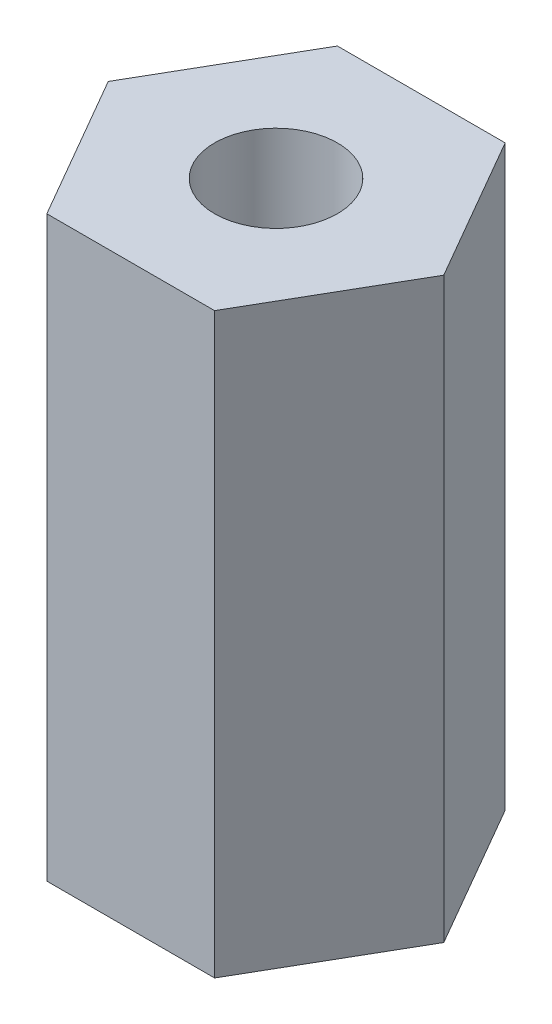
ISO-10303-21;
HEADER;
FILE_DESCRIPTION(('STEP AP214'),'2;1');
FILE_NAME('part.step','',(''),(''),'','','');
FILE_SCHEMA(('AUTOMOTIVE_DESIGN { 1 0 10303 214 1 1 1 1 }'));
ENDSEC;
DATA;
#1=APPLICATION_CONTEXT('core data for automotive mechanical design processes');
#2=APPLICATION_PROTOCOL_DEFINITION('international standard','automotive_design',2000,#1);
#3=PRODUCT_CONTEXT('',#1,'mechanical');
#4=PRODUCT('Part','Part','',(#3));
#5=PRODUCT_RELATED_PRODUCT_CATEGORY('part','',(#4));
#6=PRODUCT_DEFINITION_FORMATION('','',#4);
#7=PRODUCT_DEFINITION_CONTEXT('part definition',#1,'design');
#8=PRODUCT_DEFINITION('design','',#6,#7);
#9=PRODUCT_DEFINITION_SHAPE('','',#8);
#10=(LENGTH_UNIT() NAMED_UNIT(*) SI_UNIT(.MILLI.,.METRE.));
#11=(NAMED_UNIT(*) PLANE_ANGLE_UNIT() SI_UNIT($,.RADIAN.));
#12=(NAMED_UNIT(*) SI_UNIT($,.STERADIAN.) SOLID_ANGLE_UNIT());
#13=UNCERTAINTY_MEASURE_WITH_UNIT(LENGTH_MEASURE(1.E-05),#10,'distance_accuracy_value','');
#14=(GEOMETRIC_REPRESENTATION_CONTEXT(3) GLOBAL_UNCERTAINTY_ASSIGNED_CONTEXT((#13)) GLOBAL_UNIT_ASSIGNED_CONTEXT((#10,
#11,#12)) REPRESENTATION_CONTEXT('',''));
#15=CARTESIAN_POINT('',(0.,0.,0.));
#16=DIRECTION('',(0.,0.,1.));
#17=DIRECTION('',(1.,0.,0.));
#18=AXIS2_PLACEMENT_3D('',#15,#16,#17);
#19=CARTESIAN_POINT('',(1.84752086140683,12.73,-3.20000000000004));
#20=DIRECTION('',(0.,0.,1.));
#21=DIRECTION('',(1.,0.,0.));
#22=AXIS2_PLACEMENT_3D('',#19,#20,#21);
#23=PLANE('',#22);
#24=DIRECTION('',(-1.,0.,0.));
#25=VECTOR('',#24,1.);
#26=CARTESIAN_POINT('',(1.84752086140683,0.,-3.20000000000004));
#27=LINE('',#26,#25);
#28=CARTESIAN_POINT('',(1.84752086140683,0.,-3.20000000000004));
#29=VERTEX_POINT('',#28);
#30=CARTESIAN_POINT('',(-1.84752086140682,0.,-3.20000000000004));
#31=VERTEX_POINT('',#30);
#32=EDGE_CURVE('E130',#29,#31,#27,.T.);
#33=ORIENTED_EDGE('',*,*,#32,.T.);
#34=DIRECTION('',(0.,-1.,0.));
#35=VECTOR('',#34,1.);
#36=CARTESIAN_POINT('',(-1.84752086140682,12.73,-3.20000000000004));
#37=LINE('',#36,#35);
#38=CARTESIAN_POINT('',(-1.84752086140682,12.73,-3.20000000000004));
#39=VERTEX_POINT('',#38);
#40=EDGE_CURVE('E11',#39,#31,#37,.T.);
#41=ORIENTED_EDGE('',*,*,#40,.F.);
#42=DIRECTION('',(-1.,0.,0.));
#43=VECTOR('',#42,1.);
#44=CARTESIAN_POINT('',(1.84752086140683,12.73,-3.20000000000004));
#45=LINE('',#44,#43);
#46=CARTESIAN_POINT('',(1.84752086140683,12.73,-3.20000000000004));
#47=VERTEX_POINT('',#46);
#48=EDGE_CURVE('E147',#47,#39,#45,.T.);
#49=ORIENTED_EDGE('',*,*,#48,.F.);
#50=DIRECTION('',(0.,-1.,0.));
#51=VECTOR('',#50,1.);
#52=CARTESIAN_POINT('',(1.84752086140683,12.73,-3.20000000000004));
#53=LINE('',#52,#51);
#54=EDGE_CURVE('E126',#47,#29,#53,.T.);
#55=ORIENTED_EDGE('',*,*,#54,.T.);
#56=EDGE_LOOP('',(#33,#41,#49,#55));
#57=FACE_BOUND('',#56,.T.);
#58=ADVANCED_FACE('F41',(#57),#23,.F.);
#59=CARTESIAN_POINT('',(-1.84752086140682,12.73,-3.20000000000004));
#60=DIRECTION('',(0.866025403784438,0.,0.500000000000001));
#61=DIRECTION('',(0.500000000000001,0.,-0.866025403784438));
#62=AXIS2_PLACEMENT_3D('',#59,#60,#61);
#63=PLANE('',#62);
#64=DIRECTION('',(-0.500000000000001,0.,0.866025403784438));
#65=VECTOR('',#64,1.);
#66=CARTESIAN_POINT('',(-1.84752086140682,0.,-3.20000000000004));
#67=LINE('',#66,#65);
#68=CARTESIAN_POINT('',(-3.69504172281365,0.,0.));
#69=VERTEX_POINT('',#68);
#70=EDGE_CURVE('E134',#31,#69,#67,.T.);
#71=ORIENTED_EDGE('',*,*,#70,.T.);
#72=DIRECTION('',(0.,-1.,0.));
#73=VECTOR('',#72,1.);
#74=CARTESIAN_POINT('',(-3.69504172281365,12.73,0.));
#75=LINE('',#74,#73);
#76=CARTESIAN_POINT('',(-3.69504172281365,12.73,0.));
#77=VERTEX_POINT('',#76);
#78=EDGE_CURVE('E50',#77,#69,#75,.T.);
#79=ORIENTED_EDGE('',*,*,#78,.F.);
#80=DIRECTION('',(-0.500000000000001,0.,0.866025403784438));
#81=VECTOR('',#80,1.);
#82=CARTESIAN_POINT('',(-1.84752086140682,12.73,-3.20000000000004));
#83=LINE('',#82,#81);
#84=EDGE_CURVE('E95',#39,#77,#83,.T.);
#85=ORIENTED_EDGE('',*,*,#84,.F.);
#86=ORIENTED_EDGE('',*,*,#40,.T.);
#87=EDGE_LOOP('',(#71,#79,#85,#86));
#88=FACE_BOUND('',#87,.T.);
#89=ADVANCED_FACE('F176',(#88),#63,.F.);
#90=CARTESIAN_POINT('',(-3.69504172281365,12.73,0.));
#91=DIRECTION('',(0.866025403784439,0.,-0.5));
#92=DIRECTION('',(-0.5,0.,-0.866025403784439));
#93=AXIS2_PLACEMENT_3D('',#90,#91,#92);
#94=PLANE('',#93);
#95=DIRECTION('',(0.5,0.,0.866025403784439));
#96=VECTOR('',#95,1.);
#97=CARTESIAN_POINT('',(-3.69504172281365,0.,0.));
#98=LINE('',#97,#96);
#99=CARTESIAN_POINT('',(-1.84752086140681,0.,3.20000000000006));
#100=VERTEX_POINT('',#99);
#101=EDGE_CURVE('E138',#69,#100,#98,.T.);
#102=ORIENTED_EDGE('',*,*,#101,.T.);
#103=DIRECTION('',(0.,-1.,0.));
#104=VECTOR('',#103,1.);
#105=CARTESIAN_POINT('',(-1.84752086140681,12.73,3.20000000000006));
#106=LINE('',#105,#104);
#107=CARTESIAN_POINT('',(-1.84752086140681,12.73,3.20000000000006));
#108=VERTEX_POINT('',#107);
#109=EDGE_CURVE('E119',#108,#100,#106,.T.);
#110=ORIENTED_EDGE('',*,*,#109,.F.);
#111=DIRECTION('',(0.5,0.,0.866025403784439));
#112=VECTOR('',#111,1.);
#113=CARTESIAN_POINT('',(-3.69504172281365,12.73,0.));
#114=LINE('',#113,#112);
#115=EDGE_CURVE('E108',#77,#108,#114,.T.);
#116=ORIENTED_EDGE('',*,*,#115,.F.);
#117=ORIENTED_EDGE('',*,*,#78,.T.);
#118=EDGE_LOOP('',(#102,#110,#116,#117));
#119=FACE_BOUND('',#118,.T.);
#120=ADVANCED_FACE('F157',(#119),#94,.F.);
#121=CARTESIAN_POINT('',(-1.84752086140681,12.73,3.20000000000006));
#122=DIRECTION('',(0.,0.,-1.));
#123=DIRECTION('',(-1.,0.,0.));
#124=AXIS2_PLACEMENT_3D('',#121,#122,#123);
#125=PLANE('',#124);
#126=DIRECTION('',(1.,0.,0.));
#127=VECTOR('',#126,1.);
#128=CARTESIAN_POINT('',(-1.84752086140681,0.,3.20000000000006));
#129=LINE('',#128,#127);
#130=CARTESIAN_POINT('',(1.84752086140684,0.,3.20000000000006));
#131=VERTEX_POINT('',#130);
#132=EDGE_CURVE('E117',#100,#131,#129,.T.);
#133=ORIENTED_EDGE('',*,*,#132,.T.);
#134=DIRECTION('',(0.,-1.,0.));
#135=VECTOR('',#134,1.);
#136=CARTESIAN_POINT('',(1.84752086140684,12.73,3.20000000000006));
#137=LINE('',#136,#135);
#138=CARTESIAN_POINT('',(1.84752086140684,12.73,3.20000000000006));
#139=VERTEX_POINT('',#138);
#140=EDGE_CURVE('E114',#139,#131,#137,.T.);
#141=ORIENTED_EDGE('',*,*,#140,.F.);
#142=DIRECTION('',(1.,0.,0.));
#143=VECTOR('',#142,1.);
#144=CARTESIAN_POINT('',(-1.84752086140681,12.73,3.20000000000006));
#145=LINE('',#144,#143);
#146=EDGE_CURVE('E102',#108,#139,#145,.T.);
#147=ORIENTED_EDGE('',*,*,#146,.F.);
#148=ORIENTED_EDGE('',*,*,#109,.T.);
#149=EDGE_LOOP('',(#133,#141,#147,#148));
#150=FACE_BOUND('',#149,.T.);
#151=ADVANCED_FACE('F115',(#150),#125,.F.);
#152=CARTESIAN_POINT('',(1.84752086140684,12.73,3.20000000000006));
#153=DIRECTION('',(-0.866025403784438,0.,-0.500000000000001));
#154=DIRECTION('',(-0.500000000000001,0.,0.866025403784438));
#155=AXIS2_PLACEMENT_3D('',#152,#153,#154);
#156=PLANE('',#155);
#157=DIRECTION('',(0.500000000000001,0.,-0.866025403784438));
#158=VECTOR('',#157,1.);
#159=CARTESIAN_POINT('',(1.84752086140684,0.,3.20000000000006));
#160=LINE('',#159,#158);
#161=CARTESIAN_POINT('',(3.69504172281367,0.,0.));
#162=VERTEX_POINT('',#161);
#163=EDGE_CURVE('E81',#131,#162,#160,.T.);
#164=ORIENTED_EDGE('',*,*,#163,.T.);
#165=DIRECTION('',(0.,-1.,0.));
#166=VECTOR('',#165,1.);
#167=CARTESIAN_POINT('',(3.69504172281367,12.73,0.));
#168=LINE('',#167,#166);
#169=CARTESIAN_POINT('',(3.69504172281367,12.73,0.));
#170=VERTEX_POINT('',#169);
#171=EDGE_CURVE('E120',#170,#162,#168,.T.);
#172=ORIENTED_EDGE('',*,*,#171,.F.);
#173=DIRECTION('',(0.500000000000001,0.,-0.866025403784438));
#174=VECTOR('',#173,1.);
#175=CARTESIAN_POINT('',(1.84752086140684,12.73,3.20000000000006));
#176=LINE('',#175,#174);
#177=EDGE_CURVE('E106',#139,#170,#176,.T.);
#178=ORIENTED_EDGE('',*,*,#177,.F.);
#179=ORIENTED_EDGE('',*,*,#140,.T.);
#180=EDGE_LOOP('',(#164,#172,#178,#179));
#181=FACE_BOUND('',#180,.T.);
#182=ADVANCED_FACE('F122',(#181),#156,.F.);
#183=CARTESIAN_POINT('',(3.69504172281367,12.73,0.));
#184=DIRECTION('',(-0.866025403784438,0.,0.5));
#185=DIRECTION('',(0.5,0.,0.866025403784438));
#186=AXIS2_PLACEMENT_3D('',#183,#184,#185);
#187=PLANE('',#186);
#188=DIRECTION('',(-0.5,0.,-0.866025403784438));
#189=VECTOR('',#188,1.);
#190=CARTESIAN_POINT('',(3.69504172281367,0.,0.));
#191=LINE('',#190,#189);
#192=EDGE_CURVE('E87',#162,#29,#191,.T.);
#193=ORIENTED_EDGE('',*,*,#192,.T.);
#194=ORIENTED_EDGE('',*,*,#54,.F.);
#195=DIRECTION('',(-0.5,0.,-0.866025403784438));
#196=VECTOR('',#195,1.);
#197=CARTESIAN_POINT('',(3.69504172281367,12.73,0.));
#198=LINE('',#197,#196);
#199=EDGE_CURVE('E58',#170,#47,#198,.T.);
#200=ORIENTED_EDGE('',*,*,#199,.F.);
#201=ORIENTED_EDGE('',*,*,#171,.T.);
#202=EDGE_LOOP('',(#193,#194,#200,#201));
#203=FACE_BOUND('',#202,.T.);
#204=ADVANCED_FACE('F164',(#203),#187,.F.);
#205=CARTESIAN_POINT('',(0.,12.73,0.));
#206=DIRECTION('',(0.,1.,0.));
#207=DIRECTION('',(0.,0.,1.));
#208=AXIS2_PLACEMENT_3D('',#205,#206,#207);
#209=PLANE('',#208);
#210=CARTESIAN_POINT('',(0.,12.73,0.));
#211=DIRECTION('',(0.,1.,0.));
#212=DIRECTION('',(0.,0.,1.));
#213=AXIS2_PLACEMENT_3D('',#210,#211,#212);
#214=CIRCLE('',#213,1.35255);
#215=CARTESIAN_POINT('',(0.,12.73,1.35255));
#216=VERTEX_POINT('',#215);
#217=EDGE_CURVE('E276',#216,#216,#214,.T.);
#218=ORIENTED_EDGE('',*,*,#217,.F.);
#219=EDGE_LOOP('',(#218));
#220=FACE_BOUND('',#219,.T.);
#221=ORIENTED_EDGE('',*,*,#48,.T.);
#222=ORIENTED_EDGE('',*,*,#84,.T.);
#223=ORIENTED_EDGE('',*,*,#115,.T.);
#224=ORIENTED_EDGE('',*,*,#146,.T.);
#225=ORIENTED_EDGE('',*,*,#177,.T.);
#226=ORIENTED_EDGE('',*,*,#199,.T.);
#227=EDGE_LOOP('',(#221,#222,#223,#224,#225,#226));
#228=FACE_BOUND('',#227,.T.);
#229=ADVANCED_FACE('F104',(#220,#228),#209,.T.);
#230=CARTESIAN_POINT('',(0.,0.,0.));
#231=DIRECTION('',(0.,1.,0.));
#232=DIRECTION('',(0.,0.,1.));
#233=AXIS2_PLACEMENT_3D('',#230,#231,#232);
#234=PLANE('',#233);
#235=CARTESIAN_POINT('',(0.,0.,0.));
#236=DIRECTION('',(0.,-1.,0.));
#237=DIRECTION('',(0.,0.,-1.));
#238=AXIS2_PLACEMENT_3D('',#235,#236,#237);
#239=CIRCLE('',#238,0.353459892928966);
#240=CARTESIAN_POINT('',(0.,0.,-0.353459892928966));
#241=VERTEX_POINT('',#240);
#242=EDGE_CURVE('E277',#241,#241,#239,.T.);
#243=ORIENTED_EDGE('',*,*,#242,.F.);
#244=EDGE_LOOP('',(#243));
#245=FACE_BOUND('',#244,.T.);
#246=ORIENTED_EDGE('',*,*,#32,.F.);
#247=ORIENTED_EDGE('',*,*,#192,.F.);
#248=ORIENTED_EDGE('',*,*,#163,.F.);
#249=ORIENTED_EDGE('',*,*,#132,.F.);
#250=ORIENTED_EDGE('',*,*,#101,.F.);
#251=ORIENTED_EDGE('',*,*,#70,.F.);
#252=EDGE_LOOP('',(#246,#247,#248,#249,#250,#251));
#253=FACE_BOUND('',#252,.T.);
#254=ADVANCED_FACE('F160',(#245,#253),#234,.F.);
#255=CARTESIAN_POINT('',(0.,6.73,0.));
#256=DIRECTION('',(0.,1.,0.));
#257=DIRECTION('',(0.,0.,1.));
#258=AXIS2_PLACEMENT_3D('',#255,#256,#257);
#259=CYLINDRICAL_SURFACE('',#258,1.35255);
#260=CARTESIAN_POINT('',(0.,6.73,0.));
#261=DIRECTION('',(0.,1.,0.));
#262=DIRECTION('',(0.,0.,1.));
#263=AXIS2_PLACEMENT_3D('',#260,#261,#262);
#264=CIRCLE('',#263,1.35255);
#265=CARTESIAN_POINT('',(0.,6.73,1.35255));
#266=VERTEX_POINT('',#265);
#267=EDGE_CURVE('E135',#266,#266,#264,.T.);
#268=ORIENTED_EDGE('',*,*,#267,.F.);
#269=EDGE_LOOP('',(#268));
#270=FACE_BOUND('',#269,.T.);
#271=ORIENTED_EDGE('',*,*,#217,.T.);
#272=EDGE_LOOP('',(#271));
#273=FACE_BOUND('',#272,.T.);
#274=ADVANCED_FACE('F200',(#270,#273),#259,.F.);
#275=CARTESIAN_POINT('',(0.,6.73,0.));
#276=DIRECTION('',(0.,1.,0.));
#277=DIRECTION('',(0.,0.,1.));
#278=AXIS2_PLACEMENT_3D('',#275,#276,#277);
#279=PLANE('',#278);
#280=ORIENTED_EDGE('',*,*,#267,.T.);
#281=EDGE_LOOP('',(#280));
#282=FACE_BOUND('',#281,.T.);
#283=ADVANCED_FACE('F213',(#282),#279,.T.);
#284=CARTESIAN_POINT('',(0.,1.,0.));
#285=DIRECTION('',(0.,-1.,0.));
#286=DIRECTION('',(0.,0.,-1.));
#287=AXIS2_PLACEMENT_3D('',#284,#285,#286);
#288=CYLINDRICAL_SURFACE('',#287,0.353459892928966);
#289=CARTESIAN_POINT('',(0.,1.,0.));
#290=DIRECTION('',(0.,-1.,0.));
#291=DIRECTION('',(0.,0.,-1.));
#292=AXIS2_PLACEMENT_3D('',#289,#290,#291);
#293=CIRCLE('',#292,0.353459892928966);
#294=CARTESIAN_POINT('',(0.,1.,-0.353459892928966));
#295=VERTEX_POINT('',#294);
#296=EDGE_CURVE('E274',#295,#295,#293,.T.);
#297=ORIENTED_EDGE('',*,*,#296,.F.);
#298=EDGE_LOOP('',(#297));
#299=FACE_BOUND('',#298,.T.);
#300=ORIENTED_EDGE('',*,*,#242,.T.);
#301=EDGE_LOOP('',(#300));
#302=FACE_BOUND('',#301,.T.);
#303=ADVANCED_FACE('F220',(#299,#302),#288,.F.);
#304=CARTESIAN_POINT('',(0.,1.,0.));
#305=DIRECTION('',(0.,-1.,0.));
#306=DIRECTION('',(0.,0.,-1.));
#307=AXIS2_PLACEMENT_3D('',#304,#305,#306);
#308=PLANE('',#307);
#309=ORIENTED_EDGE('',*,*,#296,.T.);
#310=EDGE_LOOP('',(#309));
#311=FACE_BOUND('',#310,.T.);
#312=ADVANCED_FACE('F227',(#311),#308,.T.);
#313=CLOSED_SHELL('',(#58,#89,#120,#151,#182,#204,#229,#254,#274,#283,#303,#312));
#314=MANIFOLD_SOLID_BREP('B2',#313);
#315=ADVANCED_BREP_SHAPE_REPRESENTATION('',(#18,#314),#14);
#316=SHAPE_DEFINITION_REPRESENTATION(#9,#315);
ENDSEC;
END-ISO-10303-21;
